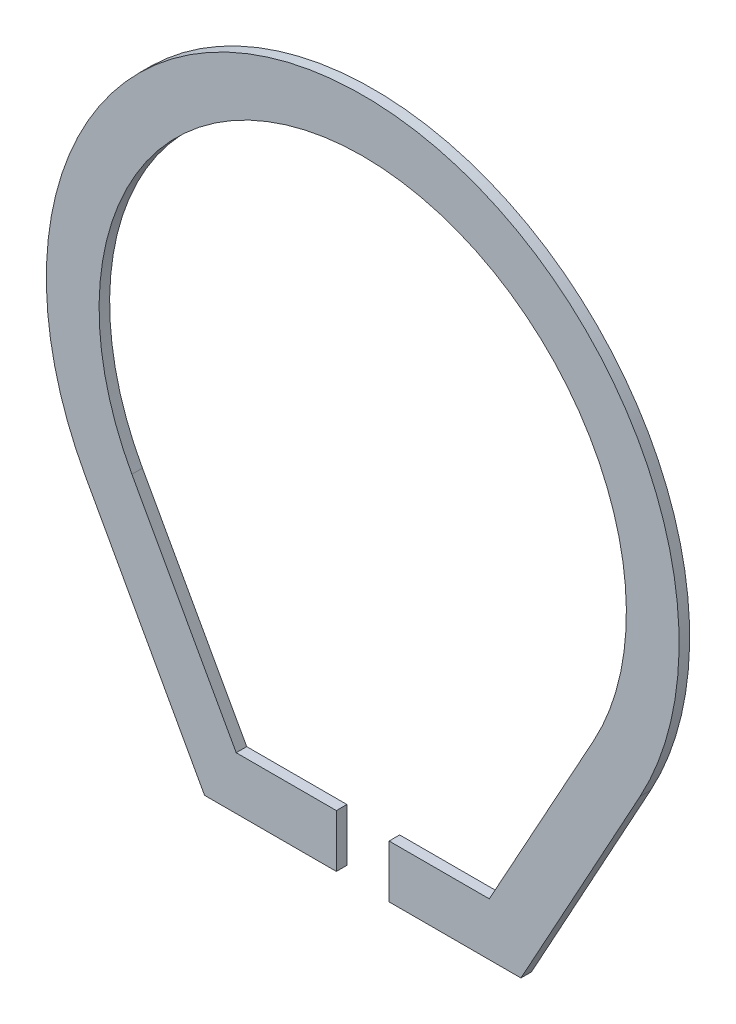
ISO-10303-21;
HEADER;
FILE_DESCRIPTION(('STEP AP214'),'2;1');
FILE_NAME('part.step','',(''),(''),'','','');
FILE_SCHEMA(('AUTOMOTIVE_DESIGN { 1 0 10303 214 1 1 1 1 }'));
ENDSEC;
DATA;
#1=APPLICATION_CONTEXT('core data for automotive mechanical design processes');
#2=APPLICATION_PROTOCOL_DEFINITION('international standard','automotive_design',2000,#1);
#3=PRODUCT_CONTEXT('',#1,'mechanical');
#4=PRODUCT('Part','Part','',(#3));
#5=PRODUCT_RELATED_PRODUCT_CATEGORY('part','',(#4));
#6=PRODUCT_DEFINITION_FORMATION('','',#4);
#7=PRODUCT_DEFINITION_CONTEXT('part definition',#1,'design');
#8=PRODUCT_DEFINITION('design','',#6,#7);
#9=PRODUCT_DEFINITION_SHAPE('','',#8);
#10=(LENGTH_UNIT() NAMED_UNIT(*) SI_UNIT(.MILLI.,.METRE.));
#11=(NAMED_UNIT(*) PLANE_ANGLE_UNIT() SI_UNIT($,.RADIAN.));
#12=(NAMED_UNIT(*) SI_UNIT($,.STERADIAN.) SOLID_ANGLE_UNIT());
#13=UNCERTAINTY_MEASURE_WITH_UNIT(LENGTH_MEASURE(1.E-05),#10,'distance_accuracy_value','');
#14=(GEOMETRIC_REPRESENTATION_CONTEXT(3) GLOBAL_UNCERTAINTY_ASSIGNED_CONTEXT((#13)) GLOBAL_UNIT_ASSIGNED_CONTEXT((#10,
#11,#12)) REPRESENTATION_CONTEXT('',''));
#15=CARTESIAN_POINT('',(0.,0.,0.));
#16=DIRECTION('',(0.,0.,1.));
#17=DIRECTION('',(1.,0.,0.));
#18=AXIS2_PLACEMENT_3D('',#15,#16,#17);
#19=CARTESIAN_POINT('',(2.5,-32.5,1.));
#20=DIRECTION('',(1.,0.,0.));
#21=DIRECTION('',(0.,0.,-1.));
#22=AXIS2_PLACEMENT_3D('',#19,#20,#21);
#23=PLANE('',#22);
#24=DIRECTION('',(0.,-1.,0.));
#25=VECTOR('',#24,1.);
#26=CARTESIAN_POINT('',(2.5,-32.5,0.));
#27=LINE('',#26,#25);
#28=CARTESIAN_POINT('',(2.5,-30.,0.));
#29=VERTEX_POINT('',#28);
#30=CARTESIAN_POINT('',(2.5,-35.,0.));
#31=VERTEX_POINT('',#30);
#32=EDGE_CURVE('E172',#29,#31,#27,.T.);
#33=ORIENTED_EDGE('',*,*,#32,.T.);
#34=DIRECTION('',(0.,0.,-1.));
#35=VECTOR('',#34,1.);
#36=CARTESIAN_POINT('',(2.5,-35.,1.));
#37=LINE('',#36,#35);
#38=CARTESIAN_POINT('',(2.5,-35.,1.));
#39=VERTEX_POINT('',#38);
#40=EDGE_CURVE('E52',#39,#31,#37,.T.);
#41=ORIENTED_EDGE('',*,*,#40,.F.);
#42=DIRECTION('',(0.,-1.,0.));
#43=VECTOR('',#42,1.);
#44=CARTESIAN_POINT('',(2.5,-32.5,1.));
#45=LINE('',#44,#43);
#46=CARTESIAN_POINT('',(2.5,-30.,1.));
#47=VERTEX_POINT('',#46);
#48=EDGE_CURVE('E116',#47,#39,#45,.T.);
#49=ORIENTED_EDGE('',*,*,#48,.F.);
#50=DIRECTION('',(0.,0.,-1.));
#51=VECTOR('',#50,1.);
#52=CARTESIAN_POINT('',(2.5,-30.,1.));
#53=LINE('',#52,#51);
#54=EDGE_CURVE('E11',#47,#29,#53,.T.);
#55=ORIENTED_EDGE('',*,*,#54,.T.);
#56=EDGE_LOOP('',(#33,#41,#49,#55));
#57=FACE_BOUND('',#56,.T.);
#58=ADVANCED_FACE('F43',(#57),#23,.F.);
#59=CARTESIAN_POINT('',(4.99999999999999,-35.,1.));
#60=DIRECTION('',(0.,1.,0.));
#61=DIRECTION('',(0.,0.,1.));
#62=AXIS2_PLACEMENT_3D('',#59,#60,#61);
#63=PLANE('',#62);
#64=DIRECTION('',(1.,0.,0.));
#65=VECTOR('',#64,1.);
#66=CARTESIAN_POINT('',(4.99999999999999,-35.,0.));
#67=LINE('',#66,#65);
#68=CARTESIAN_POINT('',(15.,-35.,0.));
#69=VERTEX_POINT('',#68);
#70=EDGE_CURVE('E176',#31,#69,#67,.T.);
#71=ORIENTED_EDGE('',*,*,#70,.T.);
#72=DIRECTION('',(0.,0.,-1.));
#73=VECTOR('',#72,1.);
#74=CARTESIAN_POINT('',(15.,-35.,1.));
#75=LINE('',#74,#73);
#76=CARTESIAN_POINT('',(15.,-35.,1.));
#77=VERTEX_POINT('',#76);
#78=EDGE_CURVE('E236',#77,#69,#75,.T.);
#79=ORIENTED_EDGE('',*,*,#78,.F.);
#80=DIRECTION('',(1.,0.,0.));
#81=VECTOR('',#80,1.);
#82=CARTESIAN_POINT('',(2.5,-35.,1.));
#83=LINE('',#82,#81);
#84=EDGE_CURVE('E245',#39,#77,#83,.T.);
#85=ORIENTED_EDGE('',*,*,#84,.F.);
#86=ORIENTED_EDGE('',*,*,#40,.T.);
#87=EDGE_LOOP('',(#71,#79,#85,#86));
#88=FACE_BOUND('',#87,.T.);
#89=ADVANCED_FACE('F243',(#88),#63,.F.);
#90=CARTESIAN_POINT('',(15.,-35.,1.));
#91=DIRECTION('',(-0.876429488254552,0.481530219319478,0.));
#92=DIRECTION('',(-0.481530219319478,-0.876429488254552,0.));
#93=AXIS2_PLACEMENT_3D('',#90,#91,#92);
#94=PLANE('',#93);
#95=DIRECTION('',(0.481530219319478,0.876429488254552,0.));
#96=VECTOR('',#95,1.);
#97=CARTESIAN_POINT('',(15.,-35.,0.));
#98=LINE('',#97,#96);
#99=CARTESIAN_POINT('',(26.2928846476366,-14.4459065795843,0.));
#100=VERTEX_POINT('',#99);
#101=EDGE_CURVE('E179',#69,#100,#98,.T.);
#102=ORIENTED_EDGE('',*,*,#101,.T.);
#103=DIRECTION('',(0.,0.,-1.));
#104=VECTOR('',#103,1.);
#105=CARTESIAN_POINT('',(26.2928846476366,-14.4459065795843,1.));
#106=LINE('',#105,#104);
#107=CARTESIAN_POINT('',(26.2928846476366,-14.4459065795843,1.));
#108=VERTEX_POINT('',#107);
#109=EDGE_CURVE('E232',#108,#100,#106,.T.);
#110=ORIENTED_EDGE('',*,*,#109,.F.);
#111=DIRECTION('',(0.481530219319478,0.876429488254552,0.));
#112=VECTOR('',#111,1.);
#113=CARTESIAN_POINT('',(15.,-35.,1.));
#114=LINE('',#113,#112);
#115=EDGE_CURVE('E259',#77,#108,#114,.T.);
#116=ORIENTED_EDGE('',*,*,#115,.F.);
#117=ORIENTED_EDGE('',*,*,#78,.T.);
#118=EDGE_LOOP('',(#102,#110,#116,#117));
#119=FACE_BOUND('',#118,.T.);
#120=ADVANCED_FACE('F297',(#119),#94,.F.);
#121=CARTESIAN_POINT('',(0.,0.,1.));
#122=DIRECTION('',(0.,0.,-1.));
#123=DIRECTION('',(-1.,0.,0.));
#124=AXIS2_PLACEMENT_3D('',#121,#122,#123);
#125=CYLINDRICAL_SURFACE('',#124,30.);
#126=CARTESIAN_POINT('',(0.,0.,0.));
#127=DIRECTION('',(0.,0.,1.));
#128=DIRECTION('',(1.,0.,0.));
#129=AXIS2_PLACEMENT_3D('',#126,#127,#128);
#130=CIRCLE('',#129,30.);
#131=CARTESIAN_POINT('',(-26.2928846476366,-14.4459065795843,0.));
#132=VERTEX_POINT('',#131);
#133=EDGE_CURVE('E182',#100,#132,#130,.T.);
#134=ORIENTED_EDGE('',*,*,#133,.T.);
#135=DIRECTION('',(0.,0.,-1.));
#136=VECTOR('',#135,1.);
#137=CARTESIAN_POINT('',(-26.2928846476366,-14.4459065795843,1.));
#138=LINE('',#137,#136);
#139=CARTESIAN_POINT('',(-26.2928846476366,-14.4459065795843,1.));
#140=VERTEX_POINT('',#139);
#141=EDGE_CURVE('E228',#140,#132,#138,.T.);
#142=ORIENTED_EDGE('',*,*,#141,.F.);
#143=CARTESIAN_POINT('',(0.,0.,1.));
#144=DIRECTION('',(0.,0.,1.));
#145=DIRECTION('',(1.,0.,0.));
#146=AXIS2_PLACEMENT_3D('',#143,#144,#145);
#147=CIRCLE('',#146,30.);
#148=EDGE_CURVE('E262',#108,#140,#147,.T.);
#149=ORIENTED_EDGE('',*,*,#148,.F.);
#150=ORIENTED_EDGE('',*,*,#109,.T.);
#151=EDGE_LOOP('',(#134,#142,#149,#150));
#152=FACE_BOUND('',#151,.T.);
#153=ADVANCED_FACE('F292',(#152),#125,.T.);
#154=CARTESIAN_POINT('',(-15.,-35.,1.));
#155=DIRECTION('',(0.876429488254552,0.481530219319478,0.));
#156=DIRECTION('',(-0.481530219319478,0.876429488254552,0.));
#157=AXIS2_PLACEMENT_3D('',#154,#155,#156);
#158=PLANE('',#157);
#159=DIRECTION('',(0.481530219319478,-0.876429488254552,0.));
#160=VECTOR('',#159,1.);
#161=CARTESIAN_POINT('',(-15.,-35.,0.));
#162=LINE('',#161,#160);
#163=CARTESIAN_POINT('',(-15.,-35.,0.));
#164=VERTEX_POINT('',#163);
#165=EDGE_CURVE('E185',#132,#164,#162,.T.);
#166=ORIENTED_EDGE('',*,*,#165,.T.);
#167=DIRECTION('',(0.,0.,-1.));
#168=VECTOR('',#167,1.);
#169=CARTESIAN_POINT('',(-15.,-35.,1.));
#170=LINE('',#169,#168);
#171=CARTESIAN_POINT('',(-15.,-35.,1.));
#172=VERTEX_POINT('',#171);
#173=EDGE_CURVE('E224',#172,#164,#170,.T.);
#174=ORIENTED_EDGE('',*,*,#173,.F.);
#175=DIRECTION('',(0.481530219319478,-0.876429488254552,0.));
#176=VECTOR('',#175,1.);
#177=CARTESIAN_POINT('',(-15.,-35.,1.));
#178=LINE('',#177,#176);
#179=EDGE_CURVE('E265',#140,#172,#178,.T.);
#180=ORIENTED_EDGE('',*,*,#179,.F.);
#181=ORIENTED_EDGE('',*,*,#141,.T.);
#182=EDGE_LOOP('',(#166,#174,#180,#181));
#183=FACE_BOUND('',#182,.T.);
#184=ADVANCED_FACE('F288',(#183),#158,.F.);
#185=CARTESIAN_POINT('',(-2.5,-35.,1.));
#186=DIRECTION('',(0.,1.,0.));
#187=DIRECTION('',(0.,0.,1.));
#188=AXIS2_PLACEMENT_3D('',#185,#186,#187);
#189=PLANE('',#188);
#190=DIRECTION('',(1.,0.,0.));
#191=VECTOR('',#190,1.);
#192=CARTESIAN_POINT('',(-2.5,-35.,0.));
#193=LINE('',#192,#191);
#194=CARTESIAN_POINT('',(-2.5,-35.,0.));
#195=VERTEX_POINT('',#194);
#196=EDGE_CURVE('E189',#164,#195,#193,.T.);
#197=ORIENTED_EDGE('',*,*,#196,.T.);
#198=DIRECTION('',(0.,0.,-1.));
#199=VECTOR('',#198,1.);
#200=CARTESIAN_POINT('',(-2.5,-35.,1.));
#201=LINE('',#200,#199);
#202=CARTESIAN_POINT('',(-2.5,-35.,1.));
#203=VERTEX_POINT('',#202);
#204=EDGE_CURVE('E220',#203,#195,#201,.T.);
#205=ORIENTED_EDGE('',*,*,#204,.F.);
#206=DIRECTION('',(1.,0.,0.));
#207=VECTOR('',#206,1.);
#208=CARTESIAN_POINT('',(-15.,-35.,1.));
#209=LINE('',#208,#207);
#210=EDGE_CURVE('E268',#172,#203,#209,.T.);
#211=ORIENTED_EDGE('',*,*,#210,.F.);
#212=ORIENTED_EDGE('',*,*,#173,.T.);
#213=EDGE_LOOP('',(#197,#205,#211,#212));
#214=FACE_BOUND('',#213,.T.);
#215=ADVANCED_FACE('F284',(#214),#189,.F.);
#216=CARTESIAN_POINT('',(-2.5,-32.5,1.));
#217=DIRECTION('',(-1.,0.,0.));
#218=DIRECTION('',(0.,0.,1.));
#219=AXIS2_PLACEMENT_3D('',#216,#217,#218);
#220=PLANE('',#219);
#221=DIRECTION('',(0.,1.,0.));
#222=VECTOR('',#221,1.);
#223=CARTESIAN_POINT('',(-2.5,-32.5,0.));
#224=LINE('',#223,#222);
#225=CARTESIAN_POINT('',(-2.5,-30.,0.));
#226=VERTEX_POINT('',#225);
#227=EDGE_CURVE('E193',#195,#226,#224,.T.);
#228=ORIENTED_EDGE('',*,*,#227,.T.);
#229=DIRECTION('',(0.,0.,-1.));
#230=VECTOR('',#229,1.);
#231=CARTESIAN_POINT('',(-2.5,-30.,1.));
#232=LINE('',#231,#230);
#233=CARTESIAN_POINT('',(-2.5,-30.,1.));
#234=VERTEX_POINT('',#233);
#235=EDGE_CURVE('E216',#234,#226,#232,.T.);
#236=ORIENTED_EDGE('',*,*,#235,.F.);
#237=DIRECTION('',(0.,1.,0.));
#238=VECTOR('',#237,1.);
#239=CARTESIAN_POINT('',(-2.5,-32.5,1.));
#240=LINE('',#239,#238);
#241=EDGE_CURVE('E271',#203,#234,#240,.T.);
#242=ORIENTED_EDGE('',*,*,#241,.F.);
#243=ORIENTED_EDGE('',*,*,#204,.T.);
#244=EDGE_LOOP('',(#228,#236,#242,#243));
#245=FACE_BOUND('',#244,.T.);
#246=ADVANCED_FACE('F279',(#245),#220,.F.);
#247=CARTESIAN_POINT('',(-12.,-30.,1.));
#248=DIRECTION('',(0.,-1.,0.));
#249=DIRECTION('',(1.,0.,0.));
#250=AXIS2_PLACEMENT_3D('',#247,#248,#249);
#251=PLANE('',#250);
#252=DIRECTION('',(-1.,0.,0.));
#253=VECTOR('',#252,1.);
#254=CARTESIAN_POINT('',(-12.,-30.,0.));
#255=LINE('',#254,#253);
#256=CARTESIAN_POINT('',(-12.,-30.,0.));
#257=VERTEX_POINT('',#256);
#258=EDGE_CURVE('E197',#226,#257,#255,.T.);
#259=ORIENTED_EDGE('',*,*,#258,.T.);
#260=DIRECTION('',(0.,0.,-1.));
#261=VECTOR('',#260,1.);
#262=CARTESIAN_POINT('',(-12.,-30.,1.));
#263=LINE('',#262,#261);
#264=CARTESIAN_POINT('',(-12.,-30.,1.));
#265=VERTEX_POINT('',#264);
#266=EDGE_CURVE('E159',#265,#257,#263,.T.);
#267=ORIENTED_EDGE('',*,*,#266,.F.);
#268=DIRECTION('',(-1.,0.,0.));
#269=VECTOR('',#268,1.);
#270=CARTESIAN_POINT('',(-5.00000000000001,-30.,1.));
#271=LINE('',#270,#269);
#272=EDGE_CURVE('E148',#234,#265,#271,.T.);
#273=ORIENTED_EDGE('',*,*,#272,.F.);
#274=ORIENTED_EDGE('',*,*,#235,.T.);
#275=EDGE_LOOP('',(#259,#267,#273,#274));
#276=FACE_BOUND('',#275,.T.);
#277=ADVANCED_FACE('F281',(#276),#251,.F.);
#278=CARTESIAN_POINT('',(-12.,-30.,1.));
#279=DIRECTION('',(-0.875560042829274,-0.483109316201624,0.));
#280=DIRECTION('',(0.483109316201624,-0.875560042829274,0.));
#281=AXIS2_PLACEMENT_3D('',#278,#279,#280);
#282=PLANE('',#281);
#283=DIRECTION('',(-0.483109316201624,0.875560042829274,0.));
#284=VECTOR('',#283,1.);
#285=CARTESIAN_POINT('',(-12.,-30.,0.));
#286=LINE('',#285,#284);
#287=CARTESIAN_POINT('',(-21.8890010707318,-12.0777329050406,0.));
#288=VERTEX_POINT('',#287);
#289=EDGE_CURVE('E157',#257,#288,#286,.T.);
#290=ORIENTED_EDGE('',*,*,#289,.T.);
#291=DIRECTION('',(0.,0.,-1.));
#292=VECTOR('',#291,1.);
#293=CARTESIAN_POINT('',(-21.8890010707318,-12.0777329050406,1.));
#294=LINE('',#293,#292);
#295=CARTESIAN_POINT('',(-21.8890010707318,-12.0777329050406,1.));
#296=VERTEX_POINT('',#295);
#297=EDGE_CURVE('E154',#296,#288,#294,.T.);
#298=ORIENTED_EDGE('',*,*,#297,.F.);
#299=DIRECTION('',(-0.483109316201624,0.875560042829274,0.));
#300=VECTOR('',#299,1.);
#301=CARTESIAN_POINT('',(-12.,-30.,1.));
#302=LINE('',#301,#300);
#303=EDGE_CURVE('E142',#265,#296,#302,.T.);
#304=ORIENTED_EDGE('',*,*,#303,.F.);
#305=ORIENTED_EDGE('',*,*,#266,.T.);
#306=EDGE_LOOP('',(#290,#298,#304,#305));
#307=FACE_BOUND('',#306,.T.);
#308=ADVANCED_FACE('F155',(#307),#282,.F.);
#309=CARTESIAN_POINT('',(0.,0.,1.));
#310=DIRECTION('',(0.,0.,-1.));
#311=DIRECTION('',(-1.,0.,0.));
#312=AXIS2_PLACEMENT_3D('',#309,#310,#311);
#313=CYLINDRICAL_SURFACE('',#312,25.);
#314=CARTESIAN_POINT('',(0.,0.,0.));
#315=DIRECTION('',(0.,0.,-1.));
#316=DIRECTION('',(1.,0.,0.));
#317=AXIS2_PLACEMENT_3D('',#314,#315,#316);
#318=CIRCLE('',#317,25.);
#319=CARTESIAN_POINT('',(21.8890010707318,-12.0777329050406,0.));
#320=VERTEX_POINT('',#319);
#321=EDGE_CURVE('E102',#288,#320,#318,.T.);
#322=ORIENTED_EDGE('',*,*,#321,.T.);
#323=DIRECTION('',(0.,0.,-1.));
#324=VECTOR('',#323,1.);
#325=CARTESIAN_POINT('',(21.8890010707318,-12.0777329050406,1.));
#326=LINE('',#325,#324);
#327=CARTESIAN_POINT('',(21.8890010707318,-12.0777329050406,1.));
#328=VERTEX_POINT('',#327);
#329=EDGE_CURVE('E160',#328,#320,#326,.T.);
#330=ORIENTED_EDGE('',*,*,#329,.F.);
#331=CARTESIAN_POINT('',(0.,0.,1.));
#332=DIRECTION('',(0.,0.,-1.));
#333=DIRECTION('',(1.,0.,0.));
#334=AXIS2_PLACEMENT_3D('',#331,#332,#333);
#335=CIRCLE('',#334,25.);
#336=EDGE_CURVE('E146',#296,#328,#335,.T.);
#337=ORIENTED_EDGE('',*,*,#336,.F.);
#338=ORIENTED_EDGE('',*,*,#297,.T.);
#339=EDGE_LOOP('',(#322,#330,#337,#338));
#340=FACE_BOUND('',#339,.T.);
#341=ADVANCED_FACE('F162',(#340),#313,.F.);
#342=CARTESIAN_POINT('',(12.,-30.,1.));
#343=DIRECTION('',(0.875560042829274,-0.483109316201624,0.));
#344=DIRECTION('',(0.483109316201624,0.875560042829274,0.));
#345=AXIS2_PLACEMENT_3D('',#342,#343,#344);
#346=PLANE('',#345);
#347=DIRECTION('',(-0.483109316201623,-0.875560042829274,0.));
#348=VECTOR('',#347,1.);
#349=CARTESIAN_POINT('',(12.,-30.,0.));
#350=LINE('',#349,#348);
#351=CARTESIAN_POINT('',(12.,-30.,0.));
#352=VERTEX_POINT('',#351);
#353=EDGE_CURVE('E109',#320,#352,#350,.T.);
#354=ORIENTED_EDGE('',*,*,#353,.T.);
#355=DIRECTION('',(0.,0.,-1.));
#356=VECTOR('',#355,1.);
#357=CARTESIAN_POINT('',(12.,-30.,1.));
#358=LINE('',#357,#356);
#359=CARTESIAN_POINT('',(12.,-30.,1.));
#360=VERTEX_POINT('',#359);
#361=EDGE_CURVE('E168',#360,#352,#358,.T.);
#362=ORIENTED_EDGE('',*,*,#361,.F.);
#363=DIRECTION('',(-0.483109316201623,-0.875560042829274,0.));
#364=VECTOR('',#363,1.);
#365=CARTESIAN_POINT('',(12.,-30.,1.));
#366=LINE('',#365,#364);
#367=EDGE_CURVE('E165',#328,#360,#366,.T.);
#368=ORIENTED_EDGE('',*,*,#367,.F.);
#369=ORIENTED_EDGE('',*,*,#329,.T.);
#370=EDGE_LOOP('',(#354,#362,#368,#369));
#371=FACE_BOUND('',#370,.T.);
#372=ADVANCED_FACE('F251',(#371),#346,.F.);
#373=CARTESIAN_POINT('',(4.99999999999999,-30.,1.));
#374=DIRECTION('',(0.,-1.,0.));
#375=DIRECTION('',(1.,0.,0.));
#376=AXIS2_PLACEMENT_3D('',#373,#374,#375);
#377=PLANE('',#376);
#378=DIRECTION('',(-1.,0.,0.));
#379=VECTOR('',#378,1.);
#380=CARTESIAN_POINT('',(4.99999999999999,-30.,0.));
#381=LINE('',#380,#379);
#382=EDGE_CURVE('E206',#352,#29,#381,.T.);
#383=ORIENTED_EDGE('',*,*,#382,.T.);
#384=ORIENTED_EDGE('',*,*,#54,.F.);
#385=DIRECTION('',(-1.,0.,0.));
#386=VECTOR('',#385,1.);
#387=CARTESIAN_POINT('',(2.5,-30.,1.));
#388=LINE('',#387,#386);
#389=EDGE_CURVE('E60',#360,#47,#388,.T.);
#390=ORIENTED_EDGE('',*,*,#389,.F.);
#391=ORIENTED_EDGE('',*,*,#361,.T.);
#392=EDGE_LOOP('',(#383,#384,#390,#391));
#393=FACE_BOUND('',#392,.T.);
#394=ADVANCED_FACE('F250',(#393),#377,.F.);
#395=CARTESIAN_POINT('',(0.,0.,1.));
#396=DIRECTION('',(0.,0.,1.));
#397=DIRECTION('',(1.,0.,0.));
#398=AXIS2_PLACEMENT_3D('',#395,#396,#397);
#399=PLANE('',#398);
#400=ORIENTED_EDGE('',*,*,#389,.T.);
#401=ORIENTED_EDGE('',*,*,#48,.T.);
#402=ORIENTED_EDGE('',*,*,#84,.T.);
#403=ORIENTED_EDGE('',*,*,#115,.T.);
#404=ORIENTED_EDGE('',*,*,#148,.T.);
#405=ORIENTED_EDGE('',*,*,#179,.T.);
#406=ORIENTED_EDGE('',*,*,#210,.T.);
#407=ORIENTED_EDGE('',*,*,#241,.T.);
#408=ORIENTED_EDGE('',*,*,#272,.T.);
#409=ORIENTED_EDGE('',*,*,#303,.T.);
#410=ORIENTED_EDGE('',*,*,#336,.T.);
#411=ORIENTED_EDGE('',*,*,#367,.T.);
#412=EDGE_LOOP('',(#400,#401,#402,#403,#404,#405,#406,#407,#408,#409,#410,#411));
#413=FACE_BOUND('',#412,.T.);
#414=ADVANCED_FACE('F144',(#413),#399,.T.);
#415=CARTESIAN_POINT('',(0.,0.,0.));
#416=DIRECTION('',(0.,0.,1.));
#417=DIRECTION('',(1.,0.,0.));
#418=AXIS2_PLACEMENT_3D('',#415,#416,#417);
#419=PLANE('',#418);
#420=ORIENTED_EDGE('',*,*,#32,.F.);
#421=ORIENTED_EDGE('',*,*,#382,.F.);
#422=ORIENTED_EDGE('',*,*,#353,.F.);
#423=ORIENTED_EDGE('',*,*,#321,.F.);
#424=ORIENTED_EDGE('',*,*,#289,.F.);
#425=ORIENTED_EDGE('',*,*,#258,.F.);
#426=ORIENTED_EDGE('',*,*,#227,.F.);
#427=ORIENTED_EDGE('',*,*,#196,.F.);
#428=ORIENTED_EDGE('',*,*,#165,.F.);
#429=ORIENTED_EDGE('',*,*,#133,.F.);
#430=ORIENTED_EDGE('',*,*,#101,.F.);
#431=ORIENTED_EDGE('',*,*,#70,.F.);
#432=EDGE_LOOP('',(#420,#421,#422,#423,#424,#425,#426,#427,#428,#429,#430,#431));
#433=FACE_BOUND('',#432,.T.);
#434=ADVANCED_FACE('F248',(#433),#419,.F.);
#435=CLOSED_SHELL('',(#58,#89,#120,#153,#184,#215,#246,#277,#308,#341,#372,#394,#414,#434));
#436=MANIFOLD_SOLID_BREP('B2',#435);
#437=ADVANCED_BREP_SHAPE_REPRESENTATION('',(#18,#436),#14);
#438=SHAPE_DEFINITION_REPRESENTATION(#9,#437);
ENDSEC;
END-ISO-10303-21;
